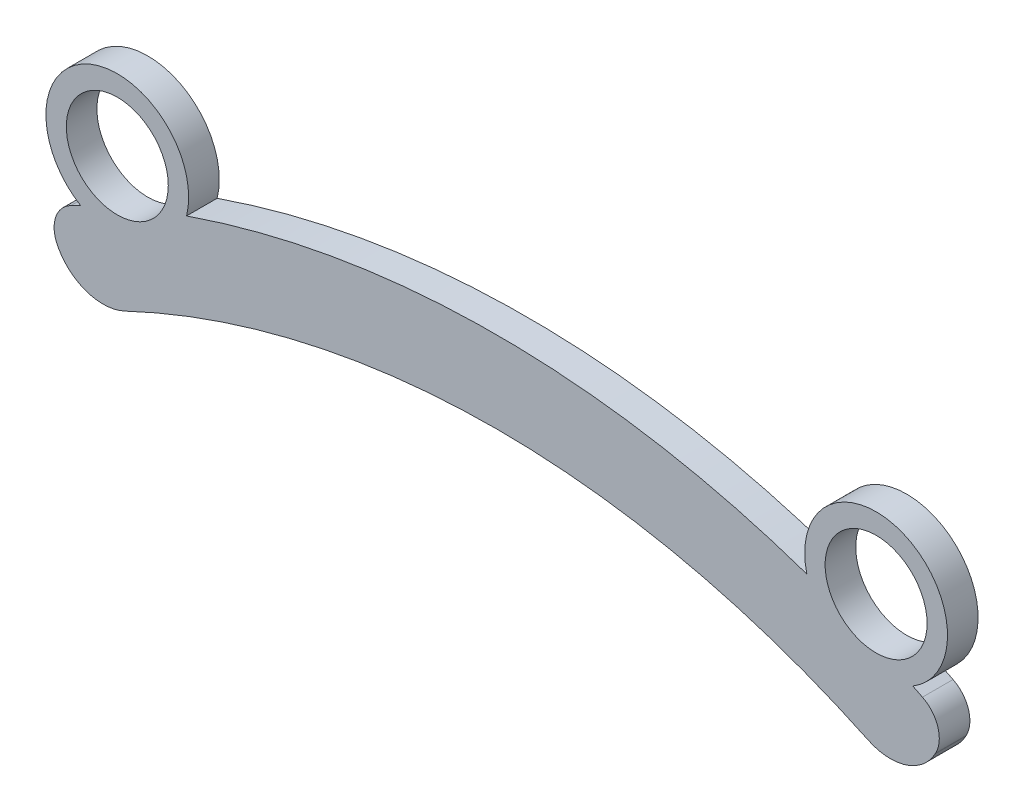
ISO-10303-21;
HEADER;
FILE_DESCRIPTION(('STEP AP214'),'2;1');
FILE_NAME('part.step','',(''),(''),'','','');
FILE_SCHEMA(('AUTOMOTIVE_DESIGN { 1 0 10303 214 1 1 1 1 }'));
ENDSEC;
DATA;
#1=APPLICATION_CONTEXT('core data for automotive mechanical design processes');
#2=APPLICATION_PROTOCOL_DEFINITION('international standard','automotive_design',2000,#1);
#3=PRODUCT_CONTEXT('',#1,'mechanical');
#4=PRODUCT('Part','Part','',(#3));
#5=PRODUCT_RELATED_PRODUCT_CATEGORY('part','',(#4));
#6=PRODUCT_DEFINITION_FORMATION('','',#4);
#7=PRODUCT_DEFINITION_CONTEXT('part definition',#1,'design');
#8=PRODUCT_DEFINITION('design','',#6,#7);
#9=PRODUCT_DEFINITION_SHAPE('','',#8);
#10=(LENGTH_UNIT() NAMED_UNIT(*) SI_UNIT(.MILLI.,.METRE.));
#11=(NAMED_UNIT(*) PLANE_ANGLE_UNIT() SI_UNIT($,.RADIAN.));
#12=(NAMED_UNIT(*) SI_UNIT($,.STERADIAN.) SOLID_ANGLE_UNIT());
#13=UNCERTAINTY_MEASURE_WITH_UNIT(LENGTH_MEASURE(1.E-05),#10,'distance_accuracy_value','');
#14=(GEOMETRIC_REPRESENTATION_CONTEXT(3) GLOBAL_UNCERTAINTY_ASSIGNED_CONTEXT((#13)) GLOBAL_UNIT_ASSIGNED_CONTEXT((#10,
#11,#12)) REPRESENTATION_CONTEXT('',''));
#15=CARTESIAN_POINT('',(0.,0.,0.));
#16=DIRECTION('',(0.,0.,1.));
#17=DIRECTION('',(1.,0.,0.));
#18=AXIS2_PLACEMENT_3D('',#15,#16,#17);
#19=CARTESIAN_POINT('',(111.63,95.9949456648908,6.));
#20=DIRECTION('',(0.,0.,-1.));
#21=DIRECTION('',(-1.,0.,0.));
#22=AXIS2_PLACEMENT_3D('',#19,#20,#21);
#23=CYLINDRICAL_SURFACE('',#22,21.);
#24=CARTESIAN_POINT('',(111.63,95.9949456648908,-3.));
#25=DIRECTION('',(0.,0.,1.));
#26=DIRECTION('',(1.,0.,0.));
#27=AXIS2_PLACEMENT_3D('',#24,#25,#26);
#28=CIRCLE('',#27,21.);
#29=CARTESIAN_POINT('',(122.407451288313,77.9714459013028,-3.));
#30=VERTEX_POINT('',#29);
#31=CARTESIAN_POINT('',(91.2544330777204,90.9120062991599,-3.));
#32=VERTEX_POINT('',#31);
#33=EDGE_CURVE('E179',#30,#32,#28,.T.);
#34=ORIENTED_EDGE('',*,*,#33,.T.);
#35=DIRECTION('',(0.,0.,-1.));
#36=VECTOR('',#35,1.);
#37=CARTESIAN_POINT('',(91.2544330777204,90.9120062991599,6.));
#38=LINE('',#37,#36);
#39=CARTESIAN_POINT('',(91.2544330777204,90.9120062991599,6.));
#40=VERTEX_POINT('',#39);
#41=EDGE_CURVE('E11',#40,#32,#38,.T.);
#42=ORIENTED_EDGE('',*,*,#41,.F.);
#43=CARTESIAN_POINT('',(111.63,95.9949456648908,6.));
#44=DIRECTION('',(0.,0.,1.));
#45=DIRECTION('',(1.,0.,0.));
#46=AXIS2_PLACEMENT_3D('',#43,#44,#45);
#47=CIRCLE('',#46,21.);
#48=CARTESIAN_POINT('',(122.407451288313,77.9714459013028,6.));
#49=VERTEX_POINT('',#48);
#50=EDGE_CURVE('E495',#49,#40,#47,.T.);
#51=ORIENTED_EDGE('',*,*,#50,.F.);
#52=DIRECTION('',(0.,0.,-1.));
#53=VECTOR('',#52,1.);
#54=CARTESIAN_POINT('',(122.407451288313,77.9714459013028,6.));
#55=LINE('',#54,#53);
#56=EDGE_CURVE('E167',#49,#30,#55,.T.);
#57=ORIENTED_EDGE('',*,*,#56,.T.);
#58=EDGE_LOOP('',(#34,#42,#51,#57));
#59=FACE_BOUND('',#58,.T.);
#60=ADVANCED_FACE('F46',(#59),#23,.T.);
#61=CARTESIAN_POINT('',(2.10155007307561E-13,-172.742366779809,6.));
#62=DIRECTION('',(0.,0.,-1.));
#63=DIRECTION('',(-1.,0.,0.));
#64=AXIS2_PLACEMENT_3D('',#61,#62,#63);
#65=CYLINDRICAL_SURFACE('',#64,279.);
#66=CARTESIAN_POINT('',(2.10155007307561E-13,-172.742366779809,-3.));
#67=DIRECTION('',(0.,0.,1.));
#68=DIRECTION('',(1.,0.,0.));
#69=AXIS2_PLACEMENT_3D('',#66,#67,#68);
#70=CIRCLE('',#69,279.);
#71=CARTESIAN_POINT('',(-91.2544330777197,90.91200629916,-3.));
#72=VERTEX_POINT('',#71);
#73=EDGE_CURVE('E183',#32,#72,#70,.T.);
#74=ORIENTED_EDGE('',*,*,#73,.T.);
#75=DIRECTION('',(0.,0.,-1.));
#76=VECTOR('',#75,1.);
#77=CARTESIAN_POINT('',(-91.2544330777197,90.91200629916,6.));
#78=LINE('',#77,#76);
#79=CARTESIAN_POINT('',(-91.2544330777197,90.91200629916,6.));
#80=VERTEX_POINT('',#79);
#81=EDGE_CURVE('E56',#80,#72,#78,.T.);
#82=ORIENTED_EDGE('',*,*,#81,.F.);
#83=CARTESIAN_POINT('',(2.10155007307561E-13,-172.742366779809,6.));
#84=DIRECTION('',(0.,0.,1.));
#85=DIRECTION('',(1.,0.,0.));
#86=AXIS2_PLACEMENT_3D('',#83,#84,#85);
#87=CIRCLE('',#86,279.);
#88=EDGE_CURVE('E115',#40,#80,#87,.T.);
#89=ORIENTED_EDGE('',*,*,#88,.F.);
#90=ORIENTED_EDGE('',*,*,#41,.T.);
#91=EDGE_LOOP('',(#74,#82,#89,#90));
#92=FACE_BOUND('',#91,.T.);
#93=ADVANCED_FACE('F253',(#92),#65,.T.);
#94=CARTESIAN_POINT('',(-111.63,95.9949456648908,6.));
#95=DIRECTION('',(0.,0.,-1.));
#96=DIRECTION('',(-1.,0.,0.));
#97=AXIS2_PLACEMENT_3D('',#94,#95,#96);
#98=CYLINDRICAL_SURFACE('',#97,21.0000000000002);
#99=CARTESIAN_POINT('',(-111.63,95.9949456648908,-3.));
#100=DIRECTION('',(0.,0.,1.));
#101=DIRECTION('',(1.,0.,0.));
#102=AXIS2_PLACEMENT_3D('',#99,#100,#101);
#103=CIRCLE('',#102,21.0000000000002);
#104=CARTESIAN_POINT('',(-122.407451288312,77.9714459013027,-3.));
#105=VERTEX_POINT('',#104);
#106=EDGE_CURVE('E187',#105,#72,#103,.F.);
#107=ORIENTED_EDGE('',*,*,#106,.F.);
#108=DIRECTION('',(0.,0.,-1.));
#109=VECTOR('',#108,1.);
#110=CARTESIAN_POINT('',(-122.407451288312,77.9714459013027,6.));
#111=LINE('',#110,#109);
#112=CARTESIAN_POINT('',(-122.407451288312,77.9714459013027,6.));
#113=VERTEX_POINT('',#112);
#114=EDGE_CURVE('E244',#113,#105,#111,.T.);
#115=ORIENTED_EDGE('',*,*,#114,.F.);
#116=CARTESIAN_POINT('',(-111.63,95.9949456648908,6.));
#117=DIRECTION('',(0.,0.,1.));
#118=DIRECTION('',(1.,0.,0.));
#119=AXIS2_PLACEMENT_3D('',#116,#117,#118);
#120=CIRCLE('',#119,21.0000000000002);
#121=EDGE_CURVE('E252',#113,#80,#120,.F.);
#122=ORIENTED_EDGE('',*,*,#121,.T.);
#123=ORIENTED_EDGE('',*,*,#81,.T.);
#124=EDGE_LOOP('',(#107,#115,#122,#123));
#125=FACE_BOUND('',#124,.T.);
#126=ADVANCED_FACE('F250',(#125),#98,.T.);
#127=CARTESIAN_POINT('',(2.10155007307561E-13,-172.742366779809,6.));
#128=DIRECTION('',(0.,0.,-1.));
#129=DIRECTION('',(-1.,0.,0.));
#130=AXIS2_PLACEMENT_3D('',#127,#128,#129);
#131=CYLINDRICAL_SURFACE('',#130,279.);
#132=CARTESIAN_POINT('',(2.10155007307561E-13,-172.742366779809,-3.));
#133=DIRECTION('',(0.,0.,1.));
#134=DIRECTION('',(1.,0.,0.));
#135=AXIS2_PLACEMENT_3D('',#132,#133,#134);
#136=CIRCLE('',#135,279.);
#137=CARTESIAN_POINT('',(-125.261959403874,76.5575360005617,-3.));
#138=VERTEX_POINT('',#137);
#139=EDGE_CURVE('E191',#105,#138,#136,.T.);
#140=ORIENTED_EDGE('',*,*,#139,.T.);
#141=DIRECTION('',(0.,0.,-1.));
#142=VECTOR('',#141,1.);
#143=CARTESIAN_POINT('',(-125.261959403874,76.5575360005617,6.));
#144=LINE('',#143,#142);
#145=CARTESIAN_POINT('',(-125.261959403874,76.5575360005617,6.));
#146=VERTEX_POINT('',#145);
#147=EDGE_CURVE('E240',#146,#138,#144,.T.);
#148=ORIENTED_EDGE('',*,*,#147,.F.);
#149=CARTESIAN_POINT('',(2.10155007307561E-13,-172.742366779809,6.));
#150=DIRECTION('',(0.,0.,1.));
#151=DIRECTION('',(1.,0.,0.));
#152=AXIS2_PLACEMENT_3D('',#149,#150,#151);
#153=CIRCLE('',#152,279.);
#154=EDGE_CURVE('E273',#113,#146,#153,.T.);
#155=ORIENTED_EDGE('',*,*,#154,.F.);
#156=ORIENTED_EDGE('',*,*,#114,.T.);
#157=EDGE_LOOP('',(#140,#148,#155,#156));
#158=FACE_BOUND('',#157,.T.);
#159=ADVANCED_FACE('F263',(#158),#131,.T.);
#160=CARTESIAN_POINT('',(-121.221251036007,68.5156036528079,6.));
#161=DIRECTION('',(0.,0.,-1.));
#162=DIRECTION('',(-1.,0.,0.));
#163=AXIS2_PLACEMENT_3D('',#160,#161,#162);
#164=CYLINDRICAL_SURFACE('',#163,8.99999999999998);
#165=CARTESIAN_POINT('',(-121.221251036007,68.5156036528079,-3.));
#166=DIRECTION('',(0.,0.,1.));
#167=DIRECTION('',(1.,0.,0.));
#168=AXIS2_PLACEMENT_3D('',#165,#166,#167);
#169=CIRCLE('',#168,8.99999999999998);
#170=CARTESIAN_POINT('',(-129.124024122905,64.2090763352441,-3.));
#171=VERTEX_POINT('',#170);
#172=EDGE_CURVE('E194',#138,#171,#169,.T.);
#173=ORIENTED_EDGE('',*,*,#172,.T.);
#174=DIRECTION('',(0.,0.,-1.));
#175=VECTOR('',#174,1.);
#176=CARTESIAN_POINT('',(-129.124024122905,64.2090763352441,6.));
#177=LINE('',#176,#175);
#178=CARTESIAN_POINT('',(-129.124024122905,64.2090763352441,6.));
#179=VERTEX_POINT('',#178);
#180=EDGE_CURVE('E236',#179,#171,#177,.T.);
#181=ORIENTED_EDGE('',*,*,#180,.F.);
#182=CARTESIAN_POINT('',(-121.221251036007,68.5156036528079,6.));
#183=DIRECTION('',(0.,0.,1.));
#184=DIRECTION('',(1.,0.,0.));
#185=AXIS2_PLACEMENT_3D('',#182,#183,#184);
#186=CIRCLE('',#185,8.99999999999998);
#187=EDGE_CURVE('E269',#146,#179,#186,.T.);
#188=ORIENTED_EDGE('',*,*,#187,.F.);
#189=ORIENTED_EDGE('',*,*,#147,.T.);
#190=EDGE_LOOP('',(#173,#181,#188,#189));
#191=FACE_BOUND('',#190,.T.);
#192=ADVANCED_FACE('F267',(#191),#164,.T.);
#193=CARTESIAN_POINT('',(2.10155007307561E-13,-172.742366779809,6.));
#194=DIRECTION('',(0.878085898544776,0.478503035284849,0.));
#195=DIRECTION('',(-0.478503035284849,0.878085898544776,0.));
#196=AXIS2_PLACEMENT_3D('',#193,#194,#195);
#197=PLANE('',#196);
#198=DIRECTION('',(0.478503035284849,-0.878085898544776,0.));
#199=VECTOR('',#198,1.);
#200=CARTESIAN_POINT('',(2.10155007307561E-13,-172.742366779809,-3.));
#201=LINE('',#200,#199);
#202=CARTESIAN_POINT('',(-128.99628918463,63.9746739599614,-3.));
#203=VERTEX_POINT('',#202);
#204=EDGE_CURVE('E197',#171,#203,#201,.T.);
#205=ORIENTED_EDGE('',*,*,#204,.T.);
#206=DIRECTION('',(0.,0.,-1.));
#207=VECTOR('',#206,1.);
#208=CARTESIAN_POINT('',(-128.99628918463,63.9746739599614,6.));
#209=LINE('',#208,#207);
#210=CARTESIAN_POINT('',(-128.99628918463,63.9746739599614,6.));
#211=VERTEX_POINT('',#210);
#212=EDGE_CURVE('E232',#211,#203,#209,.T.);
#213=ORIENTED_EDGE('',*,*,#212,.F.);
#214=DIRECTION('',(0.478503035284849,-0.878085898544776,0.));
#215=VECTOR('',#214,1.);
#216=CARTESIAN_POINT('',(2.10155007307561E-13,-172.742366779809,6.));
#217=LINE('',#216,#215);
#218=EDGE_CURVE('E272',#179,#211,#217,.T.);
#219=ORIENTED_EDGE('',*,*,#218,.F.);
#220=ORIENTED_EDGE('',*,*,#180,.T.);
#221=EDGE_LOOP('',(#205,#213,#219,#220));
#222=FACE_BOUND('',#221,.T.);
#223=ADVANCED_FACE('F428',(#222),#197,.F.);
#224=CARTESIAN_POINT('',(-115.825000706464,71.1522194892344,6.));
#225=DIRECTION('',(0.,0.,-1.));
#226=DIRECTION('',(-1.,0.,0.));
#227=AXIS2_PLACEMENT_3D('',#224,#225,#226);
#228=CYLINDRICAL_SURFACE('',#227,15.);
#229=CARTESIAN_POINT('',(-115.825000706464,71.1522194892344,-3.));
#230=DIRECTION('',(0.,0.,1.));
#231=DIRECTION('',(1.,0.,0.));
#232=AXIS2_PLACEMENT_3D('',#229,#230,#231);
#233=CIRCLE('',#232,15.);
#234=CARTESIAN_POINT('',(-109.390278444993,57.6025202520653,-3.));
#235=VERTEX_POINT('',#234);
#236=EDGE_CURVE('E200',#203,#235,#233,.T.);
#237=ORIENTED_EDGE('',*,*,#236,.T.);
#238=DIRECTION('',(0.,0.,-1.));
#239=VECTOR('',#238,1.);
#240=CARTESIAN_POINT('',(-109.390278444993,57.6025202520653,6.));
#241=LINE('',#240,#239);
#242=CARTESIAN_POINT('',(-109.390278444993,57.6025202520653,6.));
#243=VERTEX_POINT('',#242);
#244=EDGE_CURVE('E229',#243,#235,#241,.T.);
#245=ORIENTED_EDGE('',*,*,#244,.F.);
#246=CARTESIAN_POINT('',(-115.825000706464,71.1522194892344,6.));
#247=DIRECTION('',(0.,0.,1.));
#248=DIRECTION('',(1.,0.,0.));
#249=AXIS2_PLACEMENT_3D('',#246,#247,#248);
#250=CIRCLE('',#249,15.);
#251=EDGE_CURVE('E277',#211,#243,#250,.T.);
#252=ORIENTED_EDGE('',*,*,#251,.F.);
#253=ORIENTED_EDGE('',*,*,#212,.T.);
#254=EDGE_LOOP('',(#237,#245,#252,#253));
#255=FACE_BOUND('',#254,.T.);
#256=ADVANCED_FACE('F295',(#255),#228,.T.);
#257=CARTESIAN_POINT('',(2.10155007307561E-13,-172.742366779809,6.));
#258=DIRECTION('',(0.,0.,-1.));
#259=DIRECTION('',(-1.,0.,0.));
#260=AXIS2_PLACEMENT_3D('',#257,#258,#259);
#261=CYLINDRICAL_SURFACE('',#260,255.);
#262=CARTESIAN_POINT('',(2.10155007307561E-13,-172.742366779809,-3.));
#263=DIRECTION('',(0.,0.,1.));
#264=DIRECTION('',(1.,0.,0.));
#265=AXIS2_PLACEMENT_3D('',#262,#263,#264);
#266=CIRCLE('',#265,255.);
#267=CARTESIAN_POINT('',(109.390278444994,57.6025202520653,-3.));
#268=VERTEX_POINT('',#267);
#269=EDGE_CURVE('E204',#268,#235,#266,.T.);
#270=ORIENTED_EDGE('',*,*,#269,.F.);
#271=DIRECTION('',(0.,0.,-1.));
#272=VECTOR('',#271,1.);
#273=CARTESIAN_POINT('',(109.390278444994,57.6025202520653,6.));
#274=LINE('',#273,#272);
#275=CARTESIAN_POINT('',(109.390278444994,57.6025202520653,6.));
#276=VERTEX_POINT('',#275);
#277=EDGE_CURVE('E226',#276,#268,#274,.T.);
#278=ORIENTED_EDGE('',*,*,#277,.F.);
#279=CARTESIAN_POINT('',(2.10155007307561E-13,-172.742366779809,6.));
#280=DIRECTION('',(0.,0.,1.));
#281=DIRECTION('',(1.,0.,0.));
#282=AXIS2_PLACEMENT_3D('',#279,#280,#281);
#283=CIRCLE('',#282,255.);
#284=EDGE_CURVE('E284',#276,#243,#283,.T.);
#285=ORIENTED_EDGE('',*,*,#284,.T.);
#286=ORIENTED_EDGE('',*,*,#244,.T.);
#287=EDGE_LOOP('',(#270,#278,#285,#286));
#288=FACE_BOUND('',#287,.T.);
#289=ADVANCED_FACE('F290',(#288),#261,.F.);
#290=CARTESIAN_POINT('',(115.825000706464,71.1522194892344,6.));
#291=DIRECTION('',(0.,0.,-1.));
#292=DIRECTION('',(-1.,0.,0.));
#293=AXIS2_PLACEMENT_3D('',#290,#291,#292);
#294=CYLINDRICAL_SURFACE('',#293,15.);
#295=CARTESIAN_POINT('',(115.825000706464,71.1522194892344,-3.));
#296=DIRECTION('',(0.,0.,1.));
#297=DIRECTION('',(1.,0.,0.));
#298=AXIS2_PLACEMENT_3D('',#295,#296,#297);
#299=CIRCLE('',#298,15.);
#300=CARTESIAN_POINT('',(128.99628918463,63.9746739599614,-3.));
#301=VERTEX_POINT('',#300);
#302=EDGE_CURVE('E208',#268,#301,#299,.T.);
#303=ORIENTED_EDGE('',*,*,#302,.T.);
#304=DIRECTION('',(0.,0.,-1.));
#305=VECTOR('',#304,1.);
#306=CARTESIAN_POINT('',(128.99628918463,63.9746739599614,6.));
#307=LINE('',#306,#305);
#308=CARTESIAN_POINT('',(128.99628918463,63.9746739599614,6.));
#309=VERTEX_POINT('',#308);
#310=EDGE_CURVE('E153',#309,#301,#307,.T.);
#311=ORIENTED_EDGE('',*,*,#310,.F.);
#312=CARTESIAN_POINT('',(115.825000706464,71.1522194892344,6.));
#313=DIRECTION('',(0.,0.,1.));
#314=DIRECTION('',(1.,0.,0.));
#315=AXIS2_PLACEMENT_3D('',#312,#313,#314);
#316=CIRCLE('',#315,15.);
#317=EDGE_CURVE('E159',#276,#309,#316,.T.);
#318=ORIENTED_EDGE('',*,*,#317,.F.);
#319=ORIENTED_EDGE('',*,*,#277,.T.);
#320=EDGE_LOOP('',(#303,#311,#318,#319));
#321=FACE_BOUND('',#320,.T.);
#322=ADVANCED_FACE('F299',(#321),#294,.T.);
#323=CARTESIAN_POINT('',(2.10155007307561E-13,-172.742366779809,6.));
#324=DIRECTION('',(0.878085898544776,-0.478503035284849,0.));
#325=DIRECTION('',(0.478503035284849,0.878085898544776,0.));
#326=AXIS2_PLACEMENT_3D('',#323,#324,#325);
#327=PLANE('',#326);
#328=DIRECTION('',(-0.478503035284849,-0.878085898544776,0.));
#329=VECTOR('',#328,1.);
#330=CARTESIAN_POINT('',(2.10155007307561E-13,-172.742366779809,-3.));
#331=LINE('',#330,#329);
#332=CARTESIAN_POINT('',(129.124024122905,64.2090763352441,-3.));
#333=VERTEX_POINT('',#332);
#334=EDGE_CURVE('E147',#333,#301,#331,.T.);
#335=ORIENTED_EDGE('',*,*,#334,.F.);
#336=DIRECTION('',(0.,0.,-1.));
#337=VECTOR('',#336,1.);
#338=CARTESIAN_POINT('',(129.124024122905,64.2090763352441,6.));
#339=LINE('',#338,#337);
#340=CARTESIAN_POINT('',(129.124024122905,64.2090763352441,6.));
#341=VERTEX_POINT('',#340);
#342=EDGE_CURVE('E142',#341,#333,#339,.T.);
#343=ORIENTED_EDGE('',*,*,#342,.F.);
#344=DIRECTION('',(-0.478503035284849,-0.878085898544776,0.));
#345=VECTOR('',#344,1.);
#346=CARTESIAN_POINT('',(2.10155007307561E-13,-172.742366779809,6.));
#347=LINE('',#346,#345);
#348=EDGE_CURVE('E145',#341,#309,#347,.T.);
#349=ORIENTED_EDGE('',*,*,#348,.T.);
#350=ORIENTED_EDGE('',*,*,#310,.T.);
#351=EDGE_LOOP('',(#335,#343,#349,#350));
#352=FACE_BOUND('',#351,.T.);
#353=ADVANCED_FACE('F144',(#352),#327,.T.);
#354=CARTESIAN_POINT('',(121.221251036008,68.5156036528079,6.));
#355=DIRECTION('',(0.,0.,-1.));
#356=DIRECTION('',(-1.,0.,0.));
#357=AXIS2_PLACEMENT_3D('',#354,#355,#356);
#358=CYLINDRICAL_SURFACE('',#357,8.99999999999998);
#359=CARTESIAN_POINT('',(121.221251036008,68.5156036528079,-3.));
#360=DIRECTION('',(0.,0.,1.));
#361=DIRECTION('',(1.,0.,0.));
#362=AXIS2_PLACEMENT_3D('',#359,#360,#361);
#363=CIRCLE('',#362,8.99999999999998);
#364=CARTESIAN_POINT('',(125.261959403875,76.5575360005617,-3.));
#365=VERTEX_POINT('',#364);
#366=EDGE_CURVE('E214',#365,#333,#363,.F.);
#367=ORIENTED_EDGE('',*,*,#366,.F.);
#368=DIRECTION('',(0.,0.,-1.));
#369=VECTOR('',#368,1.);
#370=CARTESIAN_POINT('',(125.261959403875,76.5575360005617,6.));
#371=LINE('',#370,#369);
#372=CARTESIAN_POINT('',(125.261959403875,76.5575360005617,6.));
#373=VERTEX_POINT('',#372);
#374=EDGE_CURVE('E104',#373,#365,#371,.T.);
#375=ORIENTED_EDGE('',*,*,#374,.F.);
#376=CARTESIAN_POINT('',(121.221251036008,68.5156036528079,6.));
#377=DIRECTION('',(0.,0.,1.));
#378=DIRECTION('',(1.,0.,0.));
#379=AXIS2_PLACEMENT_3D('',#376,#377,#378);
#380=CIRCLE('',#379,8.99999999999998);
#381=EDGE_CURVE('E156',#373,#341,#380,.F.);
#382=ORIENTED_EDGE('',*,*,#381,.T.);
#383=ORIENTED_EDGE('',*,*,#342,.T.);
#384=EDGE_LOOP('',(#367,#375,#382,#383));
#385=FACE_BOUND('',#384,.T.);
#386=ADVANCED_FACE('F163',(#385),#358,.T.);
#387=CARTESIAN_POINT('',(111.63,95.9949456648908,6.));
#388=DIRECTION('',(0.,0.,-1.));
#389=DIRECTION('',(-1.,0.,0.));
#390=AXIS2_PLACEMENT_3D('',#387,#388,#389);
#391=CYLINDRICAL_SURFACE('',#390,15.);
#392=CARTESIAN_POINT('',(111.63,95.9949456648908,6.));
#393=DIRECTION('',(0.,0.,1.));
#394=DIRECTION('',(1.,0.,0.));
#395=AXIS2_PLACEMENT_3D('',#392,#393,#394);
#396=CIRCLE('',#395,15.);
#397=CARTESIAN_POINT('',(126.63,95.9949456648908,6.));
#398=VERTEX_POINT('',#397);
#399=EDGE_CURVE('E329',#398,#398,#396,.T.);
#400=ORIENTED_EDGE('',*,*,#399,.T.);
#401=EDGE_LOOP('',(#400));
#402=FACE_BOUND('',#401,.T.);
#403=CARTESIAN_POINT('',(111.63,95.9949456648908,-3.));
#404=DIRECTION('',(0.,0.,1.));
#405=DIRECTION('',(1.,0.,0.));
#406=AXIS2_PLACEMENT_3D('',#403,#404,#405);
#407=CIRCLE('',#406,15.);
#408=CARTESIAN_POINT('',(126.63,95.9949456648908,-3.));
#409=VERTEX_POINT('',#408);
#410=EDGE_CURVE('E175',#409,#409,#407,.T.);
#411=ORIENTED_EDGE('',*,*,#410,.F.);
#412=EDGE_LOOP('',(#411));
#413=FACE_BOUND('',#412,.T.);
#414=ADVANCED_FACE('F316',(#402,#413),#391,.F.);
#415=CARTESIAN_POINT('',(-111.63,95.9949456648908,6.));
#416=DIRECTION('',(0.,0.,-1.));
#417=DIRECTION('',(-1.,0.,0.));
#418=AXIS2_PLACEMENT_3D('',#415,#416,#417);
#419=CYLINDRICAL_SURFACE('',#418,15.);
#420=CARTESIAN_POINT('',(-111.63,95.9949456648908,6.));
#421=DIRECTION('',(0.,0.,1.));
#422=DIRECTION('',(1.,0.,0.));
#423=AXIS2_PLACEMENT_3D('',#420,#421,#422);
#424=CIRCLE('',#423,15.);
#425=CARTESIAN_POINT('',(-96.6299999999998,95.9949456648908,6.));
#426=VERTEX_POINT('',#425);
#427=EDGE_CURVE('E219',#426,#426,#424,.T.);
#428=ORIENTED_EDGE('',*,*,#427,.T.);
#429=EDGE_LOOP('',(#428));
#430=FACE_BOUND('',#429,.T.);
#431=CARTESIAN_POINT('',(-111.63,95.9949456648908,-3.));
#432=DIRECTION('',(0.,0.,1.));
#433=DIRECTION('',(1.,0.,0.));
#434=AXIS2_PLACEMENT_3D('',#431,#432,#433);
#435=CIRCLE('',#434,15.);
#436=CARTESIAN_POINT('',(-96.6299999999998,95.9949456648908,-3.));
#437=VERTEX_POINT('',#436);
#438=EDGE_CURVE('E171',#437,#437,#435,.T.);
#439=ORIENTED_EDGE('',*,*,#438,.F.);
#440=EDGE_LOOP('',(#439));
#441=FACE_BOUND('',#440,.T.);
#442=ADVANCED_FACE('F48',(#430,#441),#419,.F.);
#443=CARTESIAN_POINT('',(2.10155007307561E-13,-172.742366779809,6.));
#444=DIRECTION('',(0.,0.,-1.));
#445=DIRECTION('',(-1.,0.,0.));
#446=AXIS2_PLACEMENT_3D('',#443,#444,#445);
#447=CYLINDRICAL_SURFACE('',#446,279.);
#448=CARTESIAN_POINT('',(2.10155007307561E-13,-172.742366779809,-3.));
#449=DIRECTION('',(0.,0.,1.));
#450=DIRECTION('',(1.,0.,0.));
#451=AXIS2_PLACEMENT_3D('',#448,#449,#450);
#452=CIRCLE('',#451,279.);
#453=EDGE_CURVE('E107',#365,#30,#452,.T.);
#454=ORIENTED_EDGE('',*,*,#453,.T.);
#455=ORIENTED_EDGE('',*,*,#56,.F.);
#456=CARTESIAN_POINT('',(2.10155007307561E-13,-172.742366779809,6.));
#457=DIRECTION('',(0.,0.,1.));
#458=DIRECTION('',(1.,0.,0.));
#459=AXIS2_PLACEMENT_3D('',#456,#457,#458);
#460=CIRCLE('',#459,279.);
#461=EDGE_CURVE('E64',#373,#49,#460,.T.);
#462=ORIENTED_EDGE('',*,*,#461,.F.);
#463=ORIENTED_EDGE('',*,*,#374,.T.);
#464=EDGE_LOOP('',(#454,#455,#462,#463));
#465=FACE_BOUND('',#464,.T.);
#466=ADVANCED_FACE('F323',(#465),#447,.T.);
#467=CARTESIAN_POINT('',(2.10155007307561E-13,-172.742366779809,6.));
#468=DIRECTION('',(0.,0.,1.));
#469=DIRECTION('',(1.,0.,0.));
#470=AXIS2_PLACEMENT_3D('',#467,#468,#469);
#471=PLANE('',#470);
#472=ORIENTED_EDGE('',*,*,#427,.F.);
#473=EDGE_LOOP('',(#472));
#474=FACE_BOUND('',#473,.T.);
#475=ORIENTED_EDGE('',*,*,#399,.F.);
#476=EDGE_LOOP('',(#475));
#477=FACE_BOUND('',#476,.T.);
#478=ORIENTED_EDGE('',*,*,#50,.T.);
#479=ORIENTED_EDGE('',*,*,#88,.T.);
#480=ORIENTED_EDGE('',*,*,#121,.F.);
#481=ORIENTED_EDGE('',*,*,#154,.T.);
#482=ORIENTED_EDGE('',*,*,#187,.T.);
#483=ORIENTED_EDGE('',*,*,#218,.T.);
#484=ORIENTED_EDGE('',*,*,#251,.T.);
#485=ORIENTED_EDGE('',*,*,#284,.F.);
#486=ORIENTED_EDGE('',*,*,#317,.T.);
#487=ORIENTED_EDGE('',*,*,#348,.F.);
#488=ORIENTED_EDGE('',*,*,#381,.F.);
#489=ORIENTED_EDGE('',*,*,#461,.T.);
#490=EDGE_LOOP('',(#478,#479,#480,#481,#482,#483,#484,#485,#486,#487,#488,#489));
#491=FACE_BOUND('',#490,.T.);
#492=ADVANCED_FACE('F155',(#474,#477,#491),#471,.T.);
#493=CARTESIAN_POINT('',(2.10155007307561E-13,-172.742366779809,-3.));
#494=DIRECTION('',(0.,0.,1.));
#495=DIRECTION('',(1.,0.,0.));
#496=AXIS2_PLACEMENT_3D('',#493,#494,#495);
#497=PLANE('',#496);
#498=ORIENTED_EDGE('',*,*,#438,.T.);
#499=EDGE_LOOP('',(#498));
#500=FACE_BOUND('',#499,.T.);
#501=ORIENTED_EDGE('',*,*,#410,.T.);
#502=EDGE_LOOP('',(#501));
#503=FACE_BOUND('',#502,.T.);
#504=ORIENTED_EDGE('',*,*,#33,.F.);
#505=ORIENTED_EDGE('',*,*,#453,.F.);
#506=ORIENTED_EDGE('',*,*,#366,.T.);
#507=ORIENTED_EDGE('',*,*,#334,.T.);
#508=ORIENTED_EDGE('',*,*,#302,.F.);
#509=ORIENTED_EDGE('',*,*,#269,.T.);
#510=ORIENTED_EDGE('',*,*,#236,.F.);
#511=ORIENTED_EDGE('',*,*,#204,.F.);
#512=ORIENTED_EDGE('',*,*,#172,.F.);
#513=ORIENTED_EDGE('',*,*,#139,.F.);
#514=ORIENTED_EDGE('',*,*,#106,.T.);
#515=ORIENTED_EDGE('',*,*,#73,.F.);
#516=EDGE_LOOP('',(#504,#505,#506,#507,#508,#509,#510,#511,#512,#513,#514,#515));
#517=FACE_BOUND('',#516,.T.);
#518=ADVANCED_FACE('F258',(#500,#503,#517),#497,.F.);
#519=CLOSED_SHELL('',(#60,#93,#126,#159,#192,#223,#256,#289,#322,#353,#386,#414,#442,#466,#492,#518));
#520=MANIFOLD_SOLID_BREP('B2',#519);
#521=ADVANCED_BREP_SHAPE_REPRESENTATION('',(#18,#520),#14);
#522=SHAPE_DEFINITION_REPRESENTATION(#9,#521);
ENDSEC;
END-ISO-10303-21;
